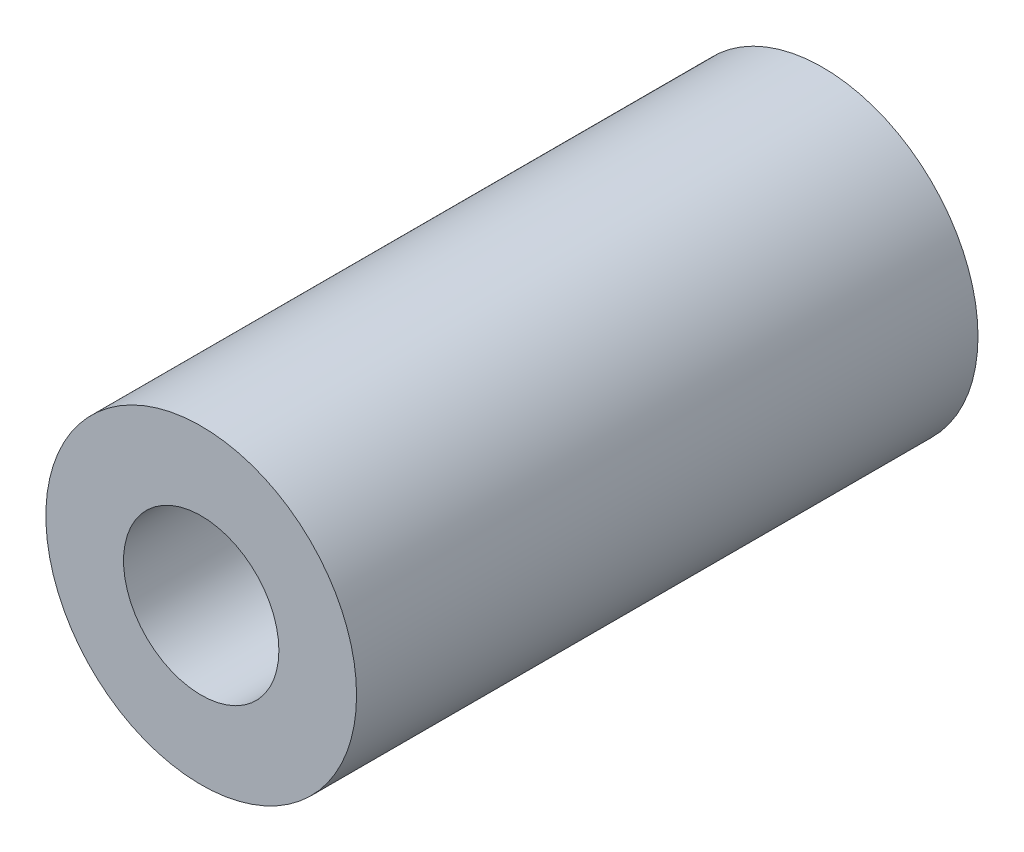
ISO-10303-21;
HEADER;
FILE_DESCRIPTION(('STEP AP214'),'2;1');
FILE_NAME('part.step','',(''),(''),'','','');
FILE_SCHEMA(('AUTOMOTIVE_DESIGN { 1 0 10303 214 1 1 1 1 }'));
ENDSEC;
DATA;
#1=APPLICATION_CONTEXT('core data for automotive mechanical design processes');
#2=APPLICATION_PROTOCOL_DEFINITION('international standard','automotive_design',2000,#1);
#3=PRODUCT_CONTEXT('',#1,'mechanical');
#4=PRODUCT('Part','Part','',(#3));
#5=PRODUCT_RELATED_PRODUCT_CATEGORY('part','',(#4));
#6=PRODUCT_DEFINITION_FORMATION('','',#4);
#7=PRODUCT_DEFINITION_CONTEXT('part definition',#1,'design');
#8=PRODUCT_DEFINITION('design','',#6,#7);
#9=PRODUCT_DEFINITION_SHAPE('','',#8);
#10=(LENGTH_UNIT() NAMED_UNIT(*) SI_UNIT(.MILLI.,.METRE.));
#11=(NAMED_UNIT(*) PLANE_ANGLE_UNIT() SI_UNIT($,.RADIAN.));
#12=(NAMED_UNIT(*) SI_UNIT($,.STERADIAN.) SOLID_ANGLE_UNIT());
#13=UNCERTAINTY_MEASURE_WITH_UNIT(LENGTH_MEASURE(1.E-05),#10,'distance_accuracy_value','');
#14=(GEOMETRIC_REPRESENTATION_CONTEXT(3) GLOBAL_UNCERTAINTY_ASSIGNED_CONTEXT((#13)) GLOBAL_UNIT_ASSIGNED_CONTEXT((#10,
#11,#12)) REPRESENTATION_CONTEXT('',''));
#15=CARTESIAN_POINT('',(0.,0.,0.));
#16=DIRECTION('',(0.,0.,1.));
#17=DIRECTION('',(1.,0.,0.));
#18=AXIS2_PLACEMENT_3D('',#15,#16,#17);
#19=CARTESIAN_POINT('',(0.,0.,12.));
#20=DIRECTION('',(0.,0.,1.));
#21=DIRECTION('',(1.,0.,0.));
#22=AXIS2_PLACEMENT_3D('',#19,#20,#21);
#23=PLANE('',#22);
#24=CARTESIAN_POINT('',(0.,0.,12.));
#25=DIRECTION('',(0.,0.,1.));
#26=DIRECTION('',(1.,0.,0.));
#27=AXIS2_PLACEMENT_3D('',#24,#25,#26);
#28=CIRCLE('',#27,3.);
#29=CARTESIAN_POINT('',(3.,0.,12.));
#30=VERTEX_POINT('',#29);
#31=EDGE_CURVE('E10',#30,#30,#28,.T.);
#32=ORIENTED_EDGE('',*,*,#31,.T.);
#33=EDGE_LOOP('',(#32));
#34=FACE_BOUND('',#33,.T.);
#35=CARTESIAN_POINT('',(0.,0.,12.));
#36=DIRECTION('',(0.,0.,1.));
#37=DIRECTION('',(1.,0.,0.));
#38=AXIS2_PLACEMENT_3D('',#35,#36,#37);
#39=CIRCLE('',#38,1.5);
#40=CARTESIAN_POINT('',(1.5,0.,12.));
#41=VERTEX_POINT('',#40);
#42=EDGE_CURVE('E54',#41,#41,#39,.T.);
#43=ORIENTED_EDGE('',*,*,#42,.F.);
#44=EDGE_LOOP('',(#43));
#45=FACE_BOUND('',#44,.T.);
#46=ADVANCED_FACE('F41',(#34,#45),#23,.T.);
#47=CARTESIAN_POINT('',(0.,0.,0.));
#48=DIRECTION('',(0.,0.,1.));
#49=DIRECTION('',(1.,0.,0.));
#50=AXIS2_PLACEMENT_3D('',#47,#48,#49);
#51=PLANE('',#50);
#52=CARTESIAN_POINT('',(0.,0.,0.));
#53=DIRECTION('',(0.,0.,1.));
#54=DIRECTION('',(1.,0.,0.));
#55=AXIS2_PLACEMENT_3D('',#52,#53,#54);
#56=CIRCLE('',#55,3.);
#57=CARTESIAN_POINT('',(3.,0.,0.));
#58=VERTEX_POINT('',#57);
#59=EDGE_CURVE('E45',#58,#58,#56,.T.);
#60=ORIENTED_EDGE('',*,*,#59,.F.);
#61=EDGE_LOOP('',(#60));
#62=FACE_BOUND('',#61,.T.);
#63=CARTESIAN_POINT('',(0.,0.,0.));
#64=DIRECTION('',(0.,0.,1.));
#65=DIRECTION('',(1.,0.,0.));
#66=AXIS2_PLACEMENT_3D('',#63,#64,#65);
#67=CIRCLE('',#66,1.5);
#68=CARTESIAN_POINT('',(1.5,0.,0.));
#69=VERTEX_POINT('',#68);
#70=EDGE_CURVE('E56',#69,#69,#67,.T.);
#71=ORIENTED_EDGE('',*,*,#70,.T.);
#72=EDGE_LOOP('',(#71));
#73=FACE_BOUND('',#72,.T.);
#74=ADVANCED_FACE('F68',(#62,#73),#51,.F.);
#75=CARTESIAN_POINT('',(0.,0.,12.));
#76=DIRECTION('',(0.,0.,-1.));
#77=DIRECTION('',(-1.,0.,0.));
#78=AXIS2_PLACEMENT_3D('',#75,#76,#77);
#79=CYLINDRICAL_SURFACE('',#78,3.);
#80=ORIENTED_EDGE('',*,*,#31,.F.);
#81=EDGE_LOOP('',(#80));
#82=FACE_BOUND('',#81,.T.);
#83=ORIENTED_EDGE('',*,*,#59,.T.);
#84=EDGE_LOOP('',(#83));
#85=FACE_BOUND('',#84,.T.);
#86=ADVANCED_FACE('F43',(#82,#85),#79,.T.);
#87=CARTESIAN_POINT('',(0.,0.,12.));
#88=DIRECTION('',(0.,0.,-1.));
#89=DIRECTION('',(-1.,0.,0.));
#90=AXIS2_PLACEMENT_3D('',#87,#88,#89);
#91=CYLINDRICAL_SURFACE('',#90,1.5);
#92=ORIENTED_EDGE('',*,*,#42,.T.);
#93=EDGE_LOOP('',(#92));
#94=FACE_BOUND('',#93,.T.);
#95=ORIENTED_EDGE('',*,*,#70,.F.);
#96=EDGE_LOOP('',(#95));
#97=FACE_BOUND('',#96,.T.);
#98=ADVANCED_FACE('F64',(#94,#97),#91,.F.);
#99=CLOSED_SHELL('',(#46,#74,#86,#98));
#100=MANIFOLD_SOLID_BREP('B2',#99);
#101=ADVANCED_BREP_SHAPE_REPRESENTATION('',(#18,#100),#14);
#102=SHAPE_DEFINITION_REPRESENTATION(#9,#101);
ENDSEC;
END-ISO-10303-21;
